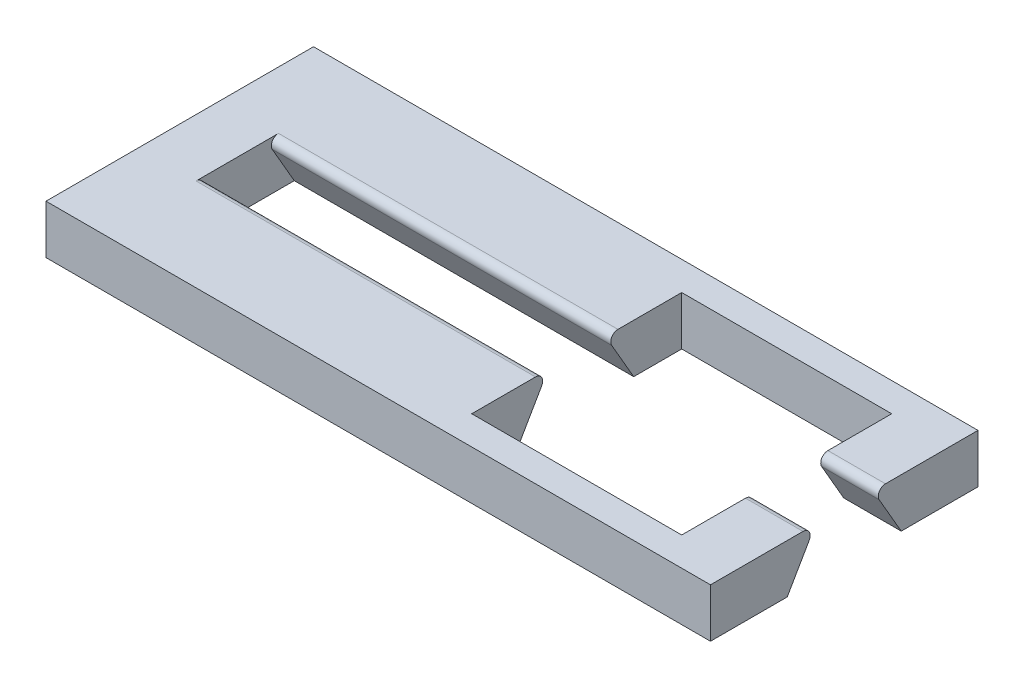
ISO-10303-21;
HEADER;
FILE_DESCRIPTION(('STEP AP214'),'2;1');
FILE_NAME('part.step','',(''),(''),'','','');
FILE_SCHEMA(('AUTOMOTIVE_DESIGN { 1 0 10303 214 1 1 1 1 }'));
ENDSEC;
DATA;
#1=APPLICATION_CONTEXT('core data for automotive mechanical design processes');
#2=APPLICATION_PROTOCOL_DEFINITION('international standard','automotive_design',2000,#1);
#3=PRODUCT_CONTEXT('',#1,'mechanical');
#4=PRODUCT('Part','Part','',(#3));
#5=PRODUCT_RELATED_PRODUCT_CATEGORY('part','',(#4));
#6=PRODUCT_DEFINITION_FORMATION('','',#4);
#7=PRODUCT_DEFINITION_CONTEXT('part definition',#1,'design');
#8=PRODUCT_DEFINITION('design','',#6,#7);
#9=PRODUCT_DEFINITION_SHAPE('','',#8);
#10=(LENGTH_UNIT() NAMED_UNIT(*) SI_UNIT(.MILLI.,.METRE.));
#11=(NAMED_UNIT(*) PLANE_ANGLE_UNIT() SI_UNIT($,.RADIAN.));
#12=(NAMED_UNIT(*) SI_UNIT($,.STERADIAN.) SOLID_ANGLE_UNIT());
#13=UNCERTAINTY_MEASURE_WITH_UNIT(LENGTH_MEASURE(1.E-05),#10,'distance_accuracy_value','');
#14=(GEOMETRIC_REPRESENTATION_CONTEXT(3) GLOBAL_UNCERTAINTY_ASSIGNED_CONTEXT((#13)) GLOBAL_UNIT_ASSIGNED_CONTEXT((#10,
#11,#12)) REPRESENTATION_CONTEXT('',''));
#15=CARTESIAN_POINT('',(0.,0.,0.));
#16=DIRECTION('',(0.,0.,1.));
#17=DIRECTION('',(1.,0.,0.));
#18=AXIS2_PLACEMENT_3D('',#15,#16,#17);
#19=CARTESIAN_POINT('',(-19.1,3.4,2.));
#20=DIRECTION('',(0.,0.500000000000004,0.866025403784436));
#21=DIRECTION('',(0.,-0.866025403784436,0.500000000000004));
#22=AXIS2_PLACEMENT_3D('',#19,#20,#21);
#23=PLANE('',#22);
#24=DIRECTION('',(0.,0.866025403784436,-0.500000000000004));
#25=VECTOR('',#24,1.);
#26=CARTESIAN_POINT('',(19.1,3.4,2.));
#27=LINE('',#26,#25);
#28=CARTESIAN_POINT('',(19.1,0.,3.96299091524475));
#29=VERTEX_POINT('',#28);
#30=CARTESIAN_POINT('',(19.1,2.65,2.43301270189223));
#31=VERTEX_POINT('',#30);
#32=EDGE_CURVE('E222',#29,#31,#27,.T.);
#33=ORIENTED_EDGE('',*,*,#32,.T.);
#34=DIRECTION('',(1.,0.,0.));
#35=VECTOR('',#34,1.);
#36=CARTESIAN_POINT('',(-19.1,2.65,2.43301270189223));
#37=LINE('',#36,#35);
#38=CARTESIAN_POINT('',(23.1,2.65,2.43301270189223));
#39=VERTEX_POINT('',#38);
#40=EDGE_CURVE('E282',#31,#39,#37,.T.);
#41=ORIENTED_EDGE('',*,*,#40,.T.);
#42=DIRECTION('',(0.,-0.866025403784436,0.500000000000004));
#43=VECTOR('',#42,1.);
#44=CARTESIAN_POINT('',(23.1,3.4,2.));
#45=LINE('',#44,#43);
#46=CARTESIAN_POINT('',(23.1,0.,3.96299091524475));
#47=VERTEX_POINT('',#46);
#48=EDGE_CURVE('E225',#39,#47,#45,.T.);
#49=ORIENTED_EDGE('',*,*,#48,.T.);
#50=DIRECTION('',(1.,0.,0.));
#51=VECTOR('',#50,1.);
#52=CARTESIAN_POINT('',(-19.1,0.,3.96299091524475));
#53=LINE('',#52,#51);
#54=EDGE_CURVE('E236',#29,#47,#53,.T.);
#55=ORIENTED_EDGE('',*,*,#54,.F.);
#56=EDGE_LOOP('',(#33,#41,#49,#55));
#57=FACE_BOUND('',#56,.T.);
#58=ADVANCED_FACE('F32',(#57),#23,.F.);
#59=CARTESIAN_POINT('',(-19.1,3.4,-2.));
#60=DIRECTION('',(0.,0.500000000000004,-0.866025403784436));
#61=DIRECTION('',(0.,0.866025403784436,0.500000000000004));
#62=AXIS2_PLACEMENT_3D('',#59,#60,#61);
#63=PLANE('',#62);
#64=DIRECTION('',(0.,0.866025403784436,0.500000000000004));
#65=VECTOR('',#64,1.);
#66=CARTESIAN_POINT('',(23.1,3.4,-2.));
#67=LINE('',#66,#65);
#68=CARTESIAN_POINT('',(23.1,0.,-3.96299091524475));
#69=VERTEX_POINT('',#68);
#70=CARTESIAN_POINT('',(23.1,2.65,-2.43301270189223));
#71=VERTEX_POINT('',#70);
#72=EDGE_CURVE('E229',#69,#71,#67,.T.);
#73=ORIENTED_EDGE('',*,*,#72,.T.);
#74=DIRECTION('',(1.,0.,0.));
#75=VECTOR('',#74,1.);
#76=CARTESIAN_POINT('',(-19.1,2.65,-2.43301270189223));
#77=LINE('',#76,#75);
#78=CARTESIAN_POINT('',(19.1,2.65,-2.43301270189223));
#79=VERTEX_POINT('',#78);
#80=EDGE_CURVE('E302',#71,#79,#77,.F.);
#81=ORIENTED_EDGE('',*,*,#80,.T.);
#82=DIRECTION('',(0.,-0.866025403784436,-0.500000000000004));
#83=VECTOR('',#82,1.);
#84=CARTESIAN_POINT('',(19.1,3.4,-2.));
#85=LINE('',#84,#83);
#86=CARTESIAN_POINT('',(19.1,0.,-3.96299091524475));
#87=VERTEX_POINT('',#86);
#88=EDGE_CURVE('E280',#79,#87,#85,.T.);
#89=ORIENTED_EDGE('',*,*,#88,.T.);
#90=DIRECTION('',(1.,0.,0.));
#91=VECTOR('',#90,1.);
#92=CARTESIAN_POINT('',(-19.1,0.,-3.96299091524475));
#93=LINE('',#92,#91);
#94=EDGE_CURVE('E196',#87,#69,#93,.T.);
#95=ORIENTED_EDGE('',*,*,#94,.T.);
#96=EDGE_LOOP('',(#73,#81,#89,#95));
#97=FACE_BOUND('',#96,.T.);
#98=ADVANCED_FACE('F355',(#97),#63,.F.);
#99=CARTESIAN_POINT('',(23.1,3.4,9.3));
#100=DIRECTION('',(-1.,0.,0.));
#101=DIRECTION('',(0.,0.,1.));
#102=AXIS2_PLACEMENT_3D('',#99,#100,#101);
#103=PLANE('',#102);
#104=ORIENTED_EDGE('',*,*,#48,.F.);
#105=CARTESIAN_POINT('',(23.1,2.9,2.86602540378444));
#106=DIRECTION('',(-1.,0.,0.));
#107=DIRECTION('',(0.,0.,1.));
#108=AXIS2_PLACEMENT_3D('',#105,#106,#107);
#109=CIRCLE('',#108,0.5);
#110=CARTESIAN_POINT('',(23.1,3.4,2.86602540378444));
#111=VERTEX_POINT('',#110);
#112=EDGE_CURVE('E285',#39,#111,#109,.F.);
#113=ORIENTED_EDGE('',*,*,#112,.T.);
#114=DIRECTION('',(0.,0.,-1.));
#115=VECTOR('',#114,1.);
#116=CARTESIAN_POINT('',(23.1,3.4,9.3));
#117=LINE('',#116,#115);
#118=CARTESIAN_POINT('',(23.1,3.4,9.3));
#119=VERTEX_POINT('',#118);
#120=EDGE_CURVE('E247',#119,#111,#117,.T.);
#121=ORIENTED_EDGE('',*,*,#120,.F.);
#122=DIRECTION('',(0.,-1.,0.));
#123=VECTOR('',#122,1.);
#124=CARTESIAN_POINT('',(23.1,3.4,9.3));
#125=LINE('',#124,#123);
#126=CARTESIAN_POINT('',(23.1,0.,9.3));
#127=VERTEX_POINT('',#126);
#128=EDGE_CURVE('E257',#119,#127,#125,.T.);
#129=ORIENTED_EDGE('',*,*,#128,.T.);
#130=DIRECTION('',(0.,0.,-1.));
#131=VECTOR('',#130,1.);
#132=CARTESIAN_POINT('',(23.1,0.,9.3));
#133=LINE('',#132,#131);
#134=EDGE_CURVE('E258',#127,#47,#133,.T.);
#135=ORIENTED_EDGE('',*,*,#134,.T.);
#136=EDGE_LOOP('',(#104,#113,#121,#129,#135));
#137=FACE_BOUND('',#136,.T.);
#138=ADVANCED_FACE('F357',(#137),#103,.F.);
#139=CARTESIAN_POINT('',(23.1,3.4,-2.86602540378444));
#140=VERTEX_POINT('',#139);
#141=CARTESIAN_POINT('',(23.1,3.4,-9.3));
#142=VERTEX_POINT('',#141);
#143=EDGE_CURVE('E251',#140,#142,#117,.T.);
#144=ORIENTED_EDGE('',*,*,#143,.F.);
#145=CARTESIAN_POINT('',(23.1,2.9,-2.86602540378444));
#146=DIRECTION('',(-1.,0.,0.));
#147=DIRECTION('',(0.,0.,1.));
#148=AXIS2_PLACEMENT_3D('',#145,#146,#147);
#149=CIRCLE('',#148,0.5);
#150=EDGE_CURVE('E300',#140,#71,#149,.F.);
#151=ORIENTED_EDGE('',*,*,#150,.T.);
#152=ORIENTED_EDGE('',*,*,#72,.F.);
#153=CARTESIAN_POINT('',(23.1,0.,-9.3));
#154=VERTEX_POINT('',#153);
#155=EDGE_CURVE('E243',#69,#154,#133,.T.);
#156=ORIENTED_EDGE('',*,*,#155,.T.);
#157=DIRECTION('',(0.,-1.,0.));
#158=VECTOR('',#157,1.);
#159=CARTESIAN_POINT('',(23.1,3.4,-9.3));
#160=LINE('',#159,#158);
#161=EDGE_CURVE('E275',#142,#154,#160,.T.);
#162=ORIENTED_EDGE('',*,*,#161,.F.);
#163=EDGE_LOOP('',(#144,#151,#152,#156,#162));
#164=FACE_BOUND('',#163,.T.);
#165=ADVANCED_FACE('F352',(#164),#103,.F.);
#166=CARTESIAN_POINT('',(-23.1,3.4,-9.3));
#167=DIRECTION('',(0.,0.,1.));
#168=DIRECTION('',(1.,0.,0.));
#169=AXIS2_PLACEMENT_3D('',#166,#167,#168);
#170=PLANE('',#169);
#171=DIRECTION('',(-1.,0.,0.));
#172=VECTOR('',#171,1.);
#173=CARTESIAN_POINT('',(-23.1,0.,-9.3));
#174=LINE('',#173,#172);
#175=CARTESIAN_POINT('',(-23.1,0.,-9.3));
#176=VERTEX_POINT('',#175);
#177=EDGE_CURVE('E261',#154,#176,#174,.T.);
#178=ORIENTED_EDGE('',*,*,#177,.T.);
#179=DIRECTION('',(0.,-1.,0.));
#180=VECTOR('',#179,1.);
#181=CARTESIAN_POINT('',(-23.1,3.4,-9.3));
#182=LINE('',#181,#180);
#183=CARTESIAN_POINT('',(-23.1,3.4,-9.3));
#184=VERTEX_POINT('',#183);
#185=EDGE_CURVE('E272',#184,#176,#182,.T.);
#186=ORIENTED_EDGE('',*,*,#185,.F.);
#187=DIRECTION('',(-1.,0.,0.));
#188=VECTOR('',#187,1.);
#189=CARTESIAN_POINT('',(-23.1,3.4,-9.3));
#190=LINE('',#189,#188);
#191=EDGE_CURVE('E250',#142,#184,#190,.T.);
#192=ORIENTED_EDGE('',*,*,#191,.F.);
#193=ORIENTED_EDGE('',*,*,#161,.T.);
#194=EDGE_LOOP('',(#178,#186,#192,#193));
#195=FACE_BOUND('',#194,.T.);
#196=ADVANCED_FACE('F388',(#195),#170,.F.);
#197=CARTESIAN_POINT('',(-23.1,3.4,9.3));
#198=DIRECTION('',(1.,0.,0.));
#199=DIRECTION('',(0.,0.,-1.));
#200=AXIS2_PLACEMENT_3D('',#197,#198,#199);
#201=PLANE('',#200);
#202=DIRECTION('',(0.,0.,1.));
#203=VECTOR('',#202,1.);
#204=CARTESIAN_POINT('',(-23.1,0.,9.3));
#205=LINE('',#204,#203);
#206=CARTESIAN_POINT('',(-23.1,0.,9.3));
#207=VERTEX_POINT('',#206);
#208=EDGE_CURVE('E263',#176,#207,#205,.T.);
#209=ORIENTED_EDGE('',*,*,#208,.T.);
#210=DIRECTION('',(0.,-1.,0.));
#211=VECTOR('',#210,1.);
#212=CARTESIAN_POINT('',(-23.1,3.4,9.3));
#213=LINE('',#212,#211);
#214=CARTESIAN_POINT('',(-23.1,3.4,9.3));
#215=VERTEX_POINT('',#214);
#216=EDGE_CURVE('E269',#215,#207,#213,.T.);
#217=ORIENTED_EDGE('',*,*,#216,.F.);
#218=DIRECTION('',(0.,0.,1.));
#219=VECTOR('',#218,1.);
#220=CARTESIAN_POINT('',(-23.1,3.4,9.3));
#221=LINE('',#220,#219);
#222=EDGE_CURVE('E253',#184,#215,#221,.T.);
#223=ORIENTED_EDGE('',*,*,#222,.F.);
#224=ORIENTED_EDGE('',*,*,#185,.T.);
#225=EDGE_LOOP('',(#209,#217,#223,#224));
#226=FACE_BOUND('',#225,.T.);
#227=ADVANCED_FACE('F384',(#226),#201,.F.);
#228=CARTESIAN_POINT('',(-23.1,3.4,9.3));
#229=DIRECTION('',(0.,0.,-1.));
#230=DIRECTION('',(-1.,0.,0.));
#231=AXIS2_PLACEMENT_3D('',#228,#229,#230);
#232=PLANE('',#231);
#233=DIRECTION('',(1.,0.,0.));
#234=VECTOR('',#233,1.);
#235=CARTESIAN_POINT('',(-23.1,0.,9.3));
#236=LINE('',#235,#234);
#237=EDGE_CURVE('E265',#207,#127,#236,.T.);
#238=ORIENTED_EDGE('',*,*,#237,.T.);
#239=ORIENTED_EDGE('',*,*,#128,.F.);
#240=DIRECTION('',(1.,0.,0.));
#241=VECTOR('',#240,1.);
#242=CARTESIAN_POINT('',(-23.1,3.4,9.3));
#243=LINE('',#242,#241);
#244=EDGE_CURVE('E255',#215,#119,#243,.T.);
#245=ORIENTED_EDGE('',*,*,#244,.F.);
#246=ORIENTED_EDGE('',*,*,#216,.T.);
#247=EDGE_LOOP('',(#238,#239,#245,#246));
#248=FACE_BOUND('',#247,.T.);
#249=ADVANCED_FACE('F380',(#248),#232,.F.);
#250=CARTESIAN_POINT('',(0.,3.4,0.));
#251=DIRECTION('',(0.,-1.,0.));
#252=DIRECTION('',(0.,0.,-1.));
#253=AXIS2_PLACEMENT_3D('',#250,#251,#252);
#254=PLANE('',#253);
#255=ORIENTED_EDGE('',*,*,#120,.T.);
#256=DIRECTION('',(1.,0.,0.));
#257=VECTOR('',#256,1.);
#258=CARTESIAN_POINT('',(0.,3.4,2.86602540378444));
#259=LINE('',#258,#257);
#260=CARTESIAN_POINT('',(19.1,3.4,2.86602540378444));
#261=VERTEX_POINT('',#260);
#262=EDGE_CURVE('E296',#111,#261,#259,.F.);
#263=ORIENTED_EDGE('',*,*,#262,.T.);
#264=DIRECTION('',(0.,0.,-1.));
#265=VECTOR('',#264,1.);
#266=CARTESIAN_POINT('',(19.1,3.4,-7.3));
#267=LINE('',#266,#265);
#268=CARTESIAN_POINT('',(19.1,3.4,7.3));
#269=VERTEX_POINT('',#268);
#270=EDGE_CURVE('E207',#269,#261,#267,.T.);
#271=ORIENTED_EDGE('',*,*,#270,.F.);
#272=DIRECTION('',(1.,0.,0.));
#273=VECTOR('',#272,1.);
#274=CARTESIAN_POINT('',(19.1,3.4,7.3));
#275=LINE('',#274,#273);
#276=CARTESIAN_POINT('',(4.5,3.4,7.3));
#277=VERTEX_POINT('',#276);
#278=EDGE_CURVE('E197',#277,#269,#275,.T.);
#279=ORIENTED_EDGE('',*,*,#278,.F.);
#280=DIRECTION('',(0.,0.,1.));
#281=VECTOR('',#280,1.);
#282=CARTESIAN_POINT('',(4.5,3.4,-7.3));
#283=LINE('',#282,#281);
#284=CARTESIAN_POINT('',(4.5,3.4,2.86602540378444));
#285=VERTEX_POINT('',#284);
#286=EDGE_CURVE('E212',#285,#277,#283,.T.);
#287=ORIENTED_EDGE('',*,*,#286,.F.);
#288=DIRECTION('',(1.,0.,0.));
#289=VECTOR('',#288,1.);
#290=CARTESIAN_POINT('',(0.,3.4,2.86602540378444));
#291=LINE('',#290,#289);
#292=CARTESIAN_POINT('',(-19.1,3.4,2.86602540378444));
#293=VERTEX_POINT('',#292);
#294=EDGE_CURVE('E290',#285,#293,#291,.F.);
#295=ORIENTED_EDGE('',*,*,#294,.T.);
#296=DIRECTION('',(0.,0.,1.));
#297=VECTOR('',#296,1.);
#298=CARTESIAN_POINT('',(-19.1,3.4,-2.));
#299=LINE('',#298,#297);
#300=CARTESIAN_POINT('',(-19.1,3.4,-2.86602540378444));
#301=VERTEX_POINT('',#300);
#302=EDGE_CURVE('E234',#301,#293,#299,.T.);
#303=ORIENTED_EDGE('',*,*,#302,.F.);
#304=DIRECTION('',(1.,0.,0.));
#305=VECTOR('',#304,1.);
#306=CARTESIAN_POINT('',(0.,3.4,-2.86602540378444));
#307=LINE('',#306,#305);
#308=CARTESIAN_POINT('',(4.5,3.4,-2.86602540378444));
#309=VERTEX_POINT('',#308);
#310=EDGE_CURVE('E287',#301,#309,#307,.T.);
#311=ORIENTED_EDGE('',*,*,#310,.T.);
#312=CARTESIAN_POINT('',(4.5,3.4,-7.3));
#313=VERTEX_POINT('',#312);
#314=EDGE_CURVE('E200',#313,#309,#283,.T.);
#315=ORIENTED_EDGE('',*,*,#314,.F.);
#316=DIRECTION('',(-1.,0.,0.));
#317=VECTOR('',#316,1.);
#318=CARTESIAN_POINT('',(19.1,3.4,-7.3));
#319=LINE('',#318,#317);
#320=CARTESIAN_POINT('',(19.1,3.4,-7.3));
#321=VERTEX_POINT('',#320);
#322=EDGE_CURVE('E210',#321,#313,#319,.T.);
#323=ORIENTED_EDGE('',*,*,#322,.F.);
#324=CARTESIAN_POINT('',(19.1,3.4,-2.86602540378444));
#325=VERTEX_POINT('',#324);
#326=EDGE_CURVE('E177',#325,#321,#267,.T.);
#327=ORIENTED_EDGE('',*,*,#326,.F.);
#328=DIRECTION('',(1.,0.,0.));
#329=VECTOR('',#328,1.);
#330=CARTESIAN_POINT('',(0.,3.4,-2.86602540378444));
#331=LINE('',#330,#329);
#332=EDGE_CURVE('E293',#325,#140,#331,.T.);
#333=ORIENTED_EDGE('',*,*,#332,.T.);
#334=ORIENTED_EDGE('',*,*,#143,.T.);
#335=ORIENTED_EDGE('',*,*,#191,.T.);
#336=ORIENTED_EDGE('',*,*,#222,.T.);
#337=ORIENTED_EDGE('',*,*,#244,.T.);
#338=EDGE_LOOP('',(#255,#263,#271,#279,#287,#295,#303,#311,#315,#323,#327,#333,#334,#335,#336,#337));
#339=FACE_BOUND('',#338,.T.);
#340=ADVANCED_FACE('F331',(#339),#254,.F.);
#341=CARTESIAN_POINT('',(0.,0.,0.));
#342=DIRECTION('',(0.,-1.,0.));
#343=DIRECTION('',(0.,0.,-1.));
#344=AXIS2_PLACEMENT_3D('',#341,#342,#343);
#345=PLANE('',#344);
#346=DIRECTION('',(0.,0.,-1.));
#347=VECTOR('',#346,1.);
#348=CARTESIAN_POINT('',(19.1,0.,-7.3));
#349=LINE('',#348,#347);
#350=CARTESIAN_POINT('',(19.1,0.,7.3));
#351=VERTEX_POINT('',#350);
#352=EDGE_CURVE('E191',#351,#29,#349,.T.);
#353=ORIENTED_EDGE('',*,*,#352,.T.);
#354=ORIENTED_EDGE('',*,*,#54,.T.);
#355=ORIENTED_EDGE('',*,*,#134,.F.);
#356=ORIENTED_EDGE('',*,*,#237,.F.);
#357=ORIENTED_EDGE('',*,*,#208,.F.);
#358=ORIENTED_EDGE('',*,*,#177,.F.);
#359=ORIENTED_EDGE('',*,*,#155,.F.);
#360=ORIENTED_EDGE('',*,*,#94,.F.);
#361=CARTESIAN_POINT('',(19.1,0.,-7.3));
#362=VERTEX_POINT('',#361);
#363=EDGE_CURVE('E174',#87,#362,#349,.T.);
#364=ORIENTED_EDGE('',*,*,#363,.T.);
#365=DIRECTION('',(-1.,0.,0.));
#366=VECTOR('',#365,1.);
#367=CARTESIAN_POINT('',(19.1,0.,-7.3));
#368=LINE('',#367,#366);
#369=CARTESIAN_POINT('',(4.5,0.,-7.3));
#370=VERTEX_POINT('',#369);
#371=EDGE_CURVE('E185',#362,#370,#368,.T.);
#372=ORIENTED_EDGE('',*,*,#371,.T.);
#373=DIRECTION('',(0.,0.,1.));
#374=VECTOR('',#373,1.);
#375=CARTESIAN_POINT('',(4.5,0.,-7.3));
#376=LINE('',#375,#374);
#377=CARTESIAN_POINT('',(4.5,0.,-3.96299091524475));
#378=VERTEX_POINT('',#377);
#379=EDGE_CURVE('E203',#370,#378,#376,.T.);
#380=ORIENTED_EDGE('',*,*,#379,.T.);
#381=CARTESIAN_POINT('',(-19.1,0.,-3.96299091524475));
#382=VERTEX_POINT('',#381);
#383=EDGE_CURVE('E240',#382,#378,#93,.T.);
#384=ORIENTED_EDGE('',*,*,#383,.F.);
#385=DIRECTION('',(0.,0.,-1.));
#386=VECTOR('',#385,1.);
#387=CARTESIAN_POINT('',(-19.1,0.,3.96299091524475));
#388=LINE('',#387,#386);
#389=CARTESIAN_POINT('',(-19.1,0.,3.96299091524475));
#390=VERTEX_POINT('',#389);
#391=EDGE_CURVE('E228',#390,#382,#388,.T.);
#392=ORIENTED_EDGE('',*,*,#391,.F.);
#393=CARTESIAN_POINT('',(4.5,0.,3.96299091524475));
#394=VERTEX_POINT('',#393);
#395=EDGE_CURVE('E244',#390,#394,#53,.T.);
#396=ORIENTED_EDGE('',*,*,#395,.T.);
#397=CARTESIAN_POINT('',(4.5,0.,7.3));
#398=VERTEX_POINT('',#397);
#399=EDGE_CURVE('E190',#394,#398,#376,.T.);
#400=ORIENTED_EDGE('',*,*,#399,.T.);
#401=DIRECTION('',(1.,0.,0.));
#402=VECTOR('',#401,1.);
#403=CARTESIAN_POINT('',(19.1,0.,7.3));
#404=LINE('',#403,#402);
#405=EDGE_CURVE('E182',#398,#351,#404,.T.);
#406=ORIENTED_EDGE('',*,*,#405,.T.);
#407=EDGE_LOOP('',(#353,#354,#355,#356,#357,#358,#359,#360,#364,#372,#380,#384,#392,#396,#400,#406));
#408=FACE_BOUND('',#407,.T.);
#409=ADVANCED_FACE('F194',(#408),#345,.T.);
#410=DIRECTION('',(0.,-0.866025403784436,0.500000000000004));
#411=VECTOR('',#410,1.);
#412=CARTESIAN_POINT('',(-19.1,3.4,2.));
#413=LINE('',#412,#411);
#414=CARTESIAN_POINT('',(-19.1,2.65,2.43301270189223));
#415=VERTEX_POINT('',#414);
#416=EDGE_CURVE('E226',#415,#390,#413,.T.);
#417=ORIENTED_EDGE('',*,*,#416,.F.);
#418=DIRECTION('',(1.,0.,0.));
#419=VECTOR('',#418,1.);
#420=CARTESIAN_POINT('',(-19.1,2.65,2.43301270189223));
#421=LINE('',#420,#419);
#422=CARTESIAN_POINT('',(4.5,2.65,2.43301270189223));
#423=VERTEX_POINT('',#422);
#424=EDGE_CURVE('E306',#415,#423,#421,.T.);
#425=ORIENTED_EDGE('',*,*,#424,.T.);
#426=DIRECTION('',(0.,-0.866025403784436,0.500000000000004));
#427=VECTOR('',#426,1.);
#428=CARTESIAN_POINT('',(4.5,3.4,2.));
#429=LINE('',#428,#427);
#430=EDGE_CURVE('E216',#423,#394,#429,.T.);
#431=ORIENTED_EDGE('',*,*,#430,.T.);
#432=ORIENTED_EDGE('',*,*,#395,.F.);
#433=EDGE_LOOP('',(#417,#425,#431,#432));
#434=FACE_BOUND('',#433,.T.);
#435=ADVANCED_FACE('F321',(#434),#23,.F.);
#436=DIRECTION('',(0.,0.866025403784436,0.500000000000004));
#437=VECTOR('',#436,1.);
#438=CARTESIAN_POINT('',(4.5,3.4,-2.));
#439=LINE('',#438,#437);
#440=CARTESIAN_POINT('',(4.5,2.65,-2.43301270189223));
#441=VERTEX_POINT('',#440);
#442=EDGE_CURVE('E278',#378,#441,#439,.T.);
#443=ORIENTED_EDGE('',*,*,#442,.T.);
#444=DIRECTION('',(1.,0.,0.));
#445=VECTOR('',#444,1.);
#446=CARTESIAN_POINT('',(-19.1,2.65,-2.43301270189223));
#447=LINE('',#446,#445);
#448=CARTESIAN_POINT('',(-19.1,2.65,-2.43301270189223));
#449=VERTEX_POINT('',#448);
#450=EDGE_CURVE('E47',#441,#449,#447,.F.);
#451=ORIENTED_EDGE('',*,*,#450,.T.);
#452=DIRECTION('',(0.,0.866025403784436,0.500000000000004));
#453=VECTOR('',#452,1.);
#454=CARTESIAN_POINT('',(-19.1,3.4,-2.));
#455=LINE('',#454,#453);
#456=EDGE_CURVE('E232',#382,#449,#455,.T.);
#457=ORIENTED_EDGE('',*,*,#456,.F.);
#458=ORIENTED_EDGE('',*,*,#383,.T.);
#459=EDGE_LOOP('',(#443,#451,#457,#458));
#460=FACE_BOUND('',#459,.T.);
#461=ADVANCED_FACE('F359',(#460),#63,.F.);
#462=CARTESIAN_POINT('',(-19.1,0.,0.));
#463=DIRECTION('',(1.,0.,0.));
#464=DIRECTION('',(0.,0.,-1.));
#465=AXIS2_PLACEMENT_3D('',#462,#463,#464);
#466=PLANE('',#465);
#467=ORIENTED_EDGE('',*,*,#302,.T.);
#468=CARTESIAN_POINT('',(-19.1,2.9,2.86602540378444));
#469=DIRECTION('',(1.,0.,0.));
#470=DIRECTION('',(0.,0.,-1.));
#471=AXIS2_PLACEMENT_3D('',#468,#469,#470);
#472=CIRCLE('',#471,0.5);
#473=EDGE_CURVE('E40',#293,#415,#472,.F.);
#474=ORIENTED_EDGE('',*,*,#473,.T.);
#475=ORIENTED_EDGE('',*,*,#416,.T.);
#476=ORIENTED_EDGE('',*,*,#391,.T.);
#477=ORIENTED_EDGE('',*,*,#456,.T.);
#478=CARTESIAN_POINT('',(-19.1,2.9,-2.86602540378444));
#479=DIRECTION('',(1.,0.,0.));
#480=DIRECTION('',(0.,0.,-1.));
#481=AXIS2_PLACEMENT_3D('',#478,#479,#480);
#482=CIRCLE('',#481,0.5);
#483=EDGE_CURVE('E11',#449,#301,#482,.F.);
#484=ORIENTED_EDGE('',*,*,#483,.T.);
#485=EDGE_LOOP('',(#467,#474,#475,#476,#477,#484));
#486=FACE_BOUND('',#485,.T.);
#487=ADVANCED_FACE('F315',(#486),#466,.T.);
#488=CARTESIAN_POINT('',(4.5,0.,-7.3));
#489=DIRECTION('',(-1.,0.,0.));
#490=DIRECTION('',(0.,0.,1.));
#491=AXIS2_PLACEMENT_3D('',#488,#489,#490);
#492=PLANE('',#491);
#493=ORIENTED_EDGE('',*,*,#314,.T.);
#494=CARTESIAN_POINT('',(4.5,2.9,-2.86602540378444));
#495=DIRECTION('',(-1.,0.,0.));
#496=DIRECTION('',(0.,0.,1.));
#497=AXIS2_PLACEMENT_3D('',#494,#495,#496);
#498=CIRCLE('',#497,0.5);
#499=EDGE_CURVE('E55',#309,#441,#498,.F.);
#500=ORIENTED_EDGE('',*,*,#499,.T.);
#501=ORIENTED_EDGE('',*,*,#442,.F.);
#502=ORIENTED_EDGE('',*,*,#379,.F.);
#503=DIRECTION('',(0.,1.,0.));
#504=VECTOR('',#503,1.);
#505=CARTESIAN_POINT('',(4.5,0.,-7.3));
#506=LINE('',#505,#504);
#507=EDGE_CURVE('E181',#370,#313,#506,.T.);
#508=ORIENTED_EDGE('',*,*,#507,.T.);
#509=EDGE_LOOP('',(#493,#500,#501,#502,#508));
#510=FACE_BOUND('',#509,.T.);
#511=ADVANCED_FACE('F343',(#510),#492,.F.);
#512=CARTESIAN_POINT('',(19.1,0.,-7.3));
#513=DIRECTION('',(1.,0.,0.));
#514=DIRECTION('',(0.,0.,-1.));
#515=AXIS2_PLACEMENT_3D('',#512,#513,#514);
#516=PLANE('',#515);
#517=ORIENTED_EDGE('',*,*,#88,.F.);
#518=CARTESIAN_POINT('',(19.1,2.9,-2.86602540378444));
#519=DIRECTION('',(1.,0.,0.));
#520=DIRECTION('',(0.,0.,-1.));
#521=AXIS2_PLACEMENT_3D('',#518,#519,#520);
#522=CIRCLE('',#521,0.5);
#523=EDGE_CURVE('E304',#79,#325,#522,.F.);
#524=ORIENTED_EDGE('',*,*,#523,.T.);
#525=ORIENTED_EDGE('',*,*,#326,.T.);
#526=DIRECTION('',(0.,1.,0.));
#527=VECTOR('',#526,1.);
#528=CARTESIAN_POINT('',(19.1,0.,-7.3));
#529=LINE('',#528,#527);
#530=EDGE_CURVE('E169',#362,#321,#529,.T.);
#531=ORIENTED_EDGE('',*,*,#530,.F.);
#532=ORIENTED_EDGE('',*,*,#363,.F.);
#533=EDGE_LOOP('',(#517,#524,#525,#531,#532));
#534=FACE_BOUND('',#533,.T.);
#535=ADVANCED_FACE('F172',(#534),#516,.F.);
#536=CARTESIAN_POINT('',(19.1,0.,-7.3));
#537=DIRECTION('',(0.,0.,-1.));
#538=DIRECTION('',(-1.,0.,0.));
#539=AXIS2_PLACEMENT_3D('',#536,#537,#538);
#540=PLANE('',#539);
#541=ORIENTED_EDGE('',*,*,#322,.T.);
#542=ORIENTED_EDGE('',*,*,#507,.F.);
#543=ORIENTED_EDGE('',*,*,#371,.F.);
#544=ORIENTED_EDGE('',*,*,#530,.T.);
#545=EDGE_LOOP('',(#541,#542,#543,#544));
#546=FACE_BOUND('',#545,.T.);
#547=ADVANCED_FACE('F186',(#546),#540,.F.);
#548=ORIENTED_EDGE('',*,*,#270,.T.);
#549=CARTESIAN_POINT('',(19.1,2.9,2.86602540378444));
#550=DIRECTION('',(1.,0.,0.));
#551=DIRECTION('',(0.,0.,-1.));
#552=AXIS2_PLACEMENT_3D('',#549,#550,#551);
#553=CIRCLE('',#552,0.5);
#554=EDGE_CURVE('E298',#261,#31,#553,.F.);
#555=ORIENTED_EDGE('',*,*,#554,.T.);
#556=ORIENTED_EDGE('',*,*,#32,.F.);
#557=ORIENTED_EDGE('',*,*,#352,.F.);
#558=DIRECTION('',(0.,1.,0.));
#559=VECTOR('',#558,1.);
#560=CARTESIAN_POINT('',(19.1,0.,7.3));
#561=LINE('',#560,#559);
#562=EDGE_CURVE('E214',#351,#269,#561,.T.);
#563=ORIENTED_EDGE('',*,*,#562,.T.);
#564=EDGE_LOOP('',(#548,#555,#556,#557,#563));
#565=FACE_BOUND('',#564,.T.);
#566=ADVANCED_FACE('F432',(#565),#516,.F.);
#567=ORIENTED_EDGE('',*,*,#430,.F.);
#568=CARTESIAN_POINT('',(4.5,2.9,2.86602540378444));
#569=DIRECTION('',(-1.,0.,0.));
#570=DIRECTION('',(0.,0.,1.));
#571=AXIS2_PLACEMENT_3D('',#568,#569,#570);
#572=CIRCLE('',#571,0.5);
#573=EDGE_CURVE('E309',#423,#285,#572,.F.);
#574=ORIENTED_EDGE('',*,*,#573,.T.);
#575=ORIENTED_EDGE('',*,*,#286,.T.);
#576=DIRECTION('',(0.,1.,0.));
#577=VECTOR('',#576,1.);
#578=CARTESIAN_POINT('',(4.5,0.,7.3));
#579=LINE('',#578,#577);
#580=EDGE_CURVE('E217',#398,#277,#579,.T.);
#581=ORIENTED_EDGE('',*,*,#580,.F.);
#582=ORIENTED_EDGE('',*,*,#399,.F.);
#583=EDGE_LOOP('',(#567,#574,#575,#581,#582));
#584=FACE_BOUND('',#583,.T.);
#585=ADVANCED_FACE('F327',(#584),#492,.F.);
#586=CARTESIAN_POINT('',(19.1,0.,7.3));
#587=DIRECTION('',(0.,0.,1.));
#588=DIRECTION('',(1.,0.,0.));
#589=AXIS2_PLACEMENT_3D('',#586,#587,#588);
#590=PLANE('',#589);
#591=ORIENTED_EDGE('',*,*,#278,.T.);
#592=ORIENTED_EDGE('',*,*,#562,.F.);
#593=ORIENTED_EDGE('',*,*,#405,.F.);
#594=ORIENTED_EDGE('',*,*,#580,.T.);
#595=EDGE_LOOP('',(#591,#592,#593,#594));
#596=FACE_BOUND('',#595,.T.);
#597=ADVANCED_FACE('F334',(#596),#590,.F.);
#598=CARTESIAN_POINT('',(-19.1,2.9,2.86602540378444));
#599=DIRECTION('',(1.,0.,0.));
#600=DIRECTION('',(0.,0.,-1.));
#601=AXIS2_PLACEMENT_3D('',#598,#599,#600);
#602=CYLINDRICAL_SURFACE('',#601,0.5);
#603=ORIENTED_EDGE('',*,*,#554,.F.);
#604=ORIENTED_EDGE('',*,*,#262,.F.);
#605=ORIENTED_EDGE('',*,*,#112,.F.);
#606=ORIENTED_EDGE('',*,*,#40,.F.);
#607=EDGE_LOOP('',(#603,#604,#605,#606));
#608=FACE_BOUND('',#607,.T.);
#609=ADVANCED_FACE('F394',(#608),#602,.T.);
#610=CARTESIAN_POINT('',(0.,2.9,-2.86602540378444));
#611=DIRECTION('',(1.,0.,0.));
#612=DIRECTION('',(0.,0.,-1.));
#613=AXIS2_PLACEMENT_3D('',#610,#611,#612);
#614=CYLINDRICAL_SURFACE('',#613,0.5);
#615=ORIENTED_EDGE('',*,*,#523,.F.);
#616=ORIENTED_EDGE('',*,*,#80,.F.);
#617=ORIENTED_EDGE('',*,*,#150,.F.);
#618=ORIENTED_EDGE('',*,*,#332,.F.);
#619=EDGE_LOOP('',(#615,#616,#617,#618));
#620=FACE_BOUND('',#619,.T.);
#621=ADVANCED_FACE('F348',(#620),#614,.T.);
#622=CARTESIAN_POINT('',(-19.1,2.9,2.86602540378444));
#623=DIRECTION('',(1.,0.,0.));
#624=DIRECTION('',(0.,0.,-1.));
#625=AXIS2_PLACEMENT_3D('',#622,#623,#624);
#626=CYLINDRICAL_SURFACE('',#625,0.5);
#627=ORIENTED_EDGE('',*,*,#473,.F.);
#628=ORIENTED_EDGE('',*,*,#294,.F.);
#629=ORIENTED_EDGE('',*,*,#573,.F.);
#630=ORIENTED_EDGE('',*,*,#424,.F.);
#631=EDGE_LOOP('',(#627,#628,#629,#630));
#632=FACE_BOUND('',#631,.T.);
#633=ADVANCED_FACE('F324',(#632),#626,.T.);
#634=CARTESIAN_POINT('',(0.,2.9,-2.86602540378444));
#635=DIRECTION('',(1.,0.,0.));
#636=DIRECTION('',(0.,0.,-1.));
#637=AXIS2_PLACEMENT_3D('',#634,#635,#636);
#638=CYLINDRICAL_SURFACE('',#637,0.5);
#639=ORIENTED_EDGE('',*,*,#483,.F.);
#640=ORIENTED_EDGE('',*,*,#450,.F.);
#641=ORIENTED_EDGE('',*,*,#499,.F.);
#642=ORIENTED_EDGE('',*,*,#310,.F.);
#643=EDGE_LOOP('',(#639,#640,#641,#642));
#644=FACE_BOUND('',#643,.T.);
#645=ADVANCED_FACE('F34',(#644),#638,.T.);
#646=CLOSED_SHELL('',(#58,#98,#138,#165,#196,#227,#249,#340,#409,#435,#461,#487,#511,#535,#547,
#566,#585,#597,#609,#621,#633,#645));
#647=MANIFOLD_SOLID_BREP('B2',#646);
#648=ADVANCED_BREP_SHAPE_REPRESENTATION('',(#18,#647),#14);
#649=SHAPE_DEFINITION_REPRESENTATION(#9,#648);
ENDSEC;
END-ISO-10303-21;
